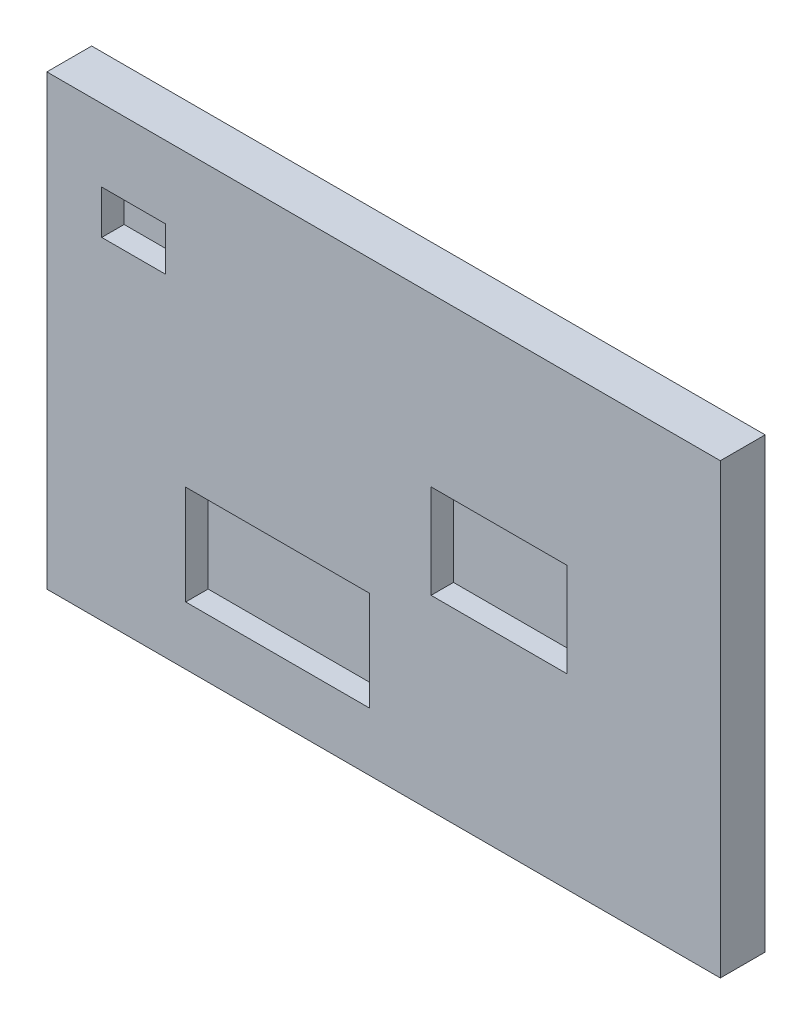
ISO-10303-21;
HEADER;
FILE_DESCRIPTION(('STEP AP214'),'2;1');
FILE_NAME('part.step','',(''),(''),'','','');
FILE_SCHEMA(('AUTOMOTIVE_DESIGN { 1 0 10303 214 1 1 1 1 }'));
ENDSEC;
DATA;
#1=APPLICATION_CONTEXT('core data for automotive mechanical design processes');
#2=APPLICATION_PROTOCOL_DEFINITION('international standard','automotive_design',2000,#1);
#3=PRODUCT_CONTEXT('',#1,'mechanical');
#4=PRODUCT('Part','Part','',(#3));
#5=PRODUCT_RELATED_PRODUCT_CATEGORY('part','',(#4));
#6=PRODUCT_DEFINITION_FORMATION('','',#4);
#7=PRODUCT_DEFINITION_CONTEXT('part definition',#1,'design');
#8=PRODUCT_DEFINITION('design','',#6,#7);
#9=PRODUCT_DEFINITION_SHAPE('','',#8);
#10=(LENGTH_UNIT() NAMED_UNIT(*) SI_UNIT(.MILLI.,.METRE.));
#11=(NAMED_UNIT(*) PLANE_ANGLE_UNIT() SI_UNIT($,.RADIAN.));
#12=(NAMED_UNIT(*) SI_UNIT($,.STERADIAN.) SOLID_ANGLE_UNIT());
#13=UNCERTAINTY_MEASURE_WITH_UNIT(LENGTH_MEASURE(1.E-05),#10,'distance_accuracy_value','');
#14=(GEOMETRIC_REPRESENTATION_CONTEXT(3) GLOBAL_UNCERTAINTY_ASSIGNED_CONTEXT((#13)) GLOBAL_UNIT_ASSIGNED_CONTEXT((#10,
#11,#12)) REPRESENTATION_CONTEXT('',''));
#15=CARTESIAN_POINT('',(0.,0.,0.));
#16=DIRECTION('',(0.,0.,1.));
#17=DIRECTION('',(1.,0.,0.));
#18=AXIS2_PLACEMENT_3D('',#15,#16,#17);
#19=CARTESIAN_POINT('',(-44.7236180904523,25.8793969849246,10.));
#20=DIRECTION('',(1.,0.,0.));
#21=DIRECTION('',(0.,0.,-1.));
#22=AXIS2_PLACEMENT_3D('',#19,#20,#21);
#23=PLANE('',#22);
#24=DIRECTION('',(0.,-1.,0.));
#25=VECTOR('',#24,1.);
#26=CARTESIAN_POINT('',(-44.7236180904523,25.8793969849246,0.));
#27=LINE('',#26,#25);
#28=CARTESIAN_POINT('',(-44.7236180904523,25.8793969849246,0.));
#29=VERTEX_POINT('',#28);
#30=CARTESIAN_POINT('',(-44.7236180904523,-74.1206030150754,0.));
#31=VERTEX_POINT('',#30);
#32=EDGE_CURVE('E198',#29,#31,#27,.T.);
#33=ORIENTED_EDGE('',*,*,#32,.T.);
#34=DIRECTION('',(0.,0.,-1.));
#35=VECTOR('',#34,1.);
#36=CARTESIAN_POINT('',(-44.7236180904523,-74.1206030150754,10.));
#37=LINE('',#36,#35);
#38=CARTESIAN_POINT('',(-44.7236180904523,-74.1206030150754,10.));
#39=VERTEX_POINT('',#38);
#40=EDGE_CURVE('E11',#39,#31,#37,.T.);
#41=ORIENTED_EDGE('',*,*,#40,.F.);
#42=DIRECTION('',(0.,-1.,0.));
#43=VECTOR('',#42,1.);
#44=CARTESIAN_POINT('',(-44.7236180904523,25.8793969849246,10.));
#45=LINE('',#44,#43);
#46=CARTESIAN_POINT('',(-44.7236180904523,25.8793969849246,10.));
#47=VERTEX_POINT('',#46);
#48=EDGE_CURVE('E289',#47,#39,#45,.T.);
#49=ORIENTED_EDGE('',*,*,#48,.F.);
#50=DIRECTION('',(0.,0.,-1.));
#51=VECTOR('',#50,1.);
#52=CARTESIAN_POINT('',(-44.7236180904523,25.8793969849246,10.));
#53=LINE('',#52,#51);
#54=EDGE_CURVE('E303',#47,#29,#53,.T.);
#55=ORIENTED_EDGE('',*,*,#54,.T.);
#56=EDGE_LOOP('',(#33,#41,#49,#55));
#57=FACE_BOUND('',#56,.T.);
#58=ADVANCED_FACE('F39',(#57),#23,.F.);
#59=CARTESIAN_POINT('',(-44.7236180904523,-74.1206030150754,10.));
#60=DIRECTION('',(0.,1.,0.));
#61=DIRECTION('',(0.,0.,1.));
#62=AXIS2_PLACEMENT_3D('',#59,#60,#61);
#63=PLANE('',#62);
#64=DIRECTION('',(1.,0.,0.));
#65=VECTOR('',#64,1.);
#66=CARTESIAN_POINT('',(-44.7236180904523,-74.1206030150754,0.));
#67=LINE('',#66,#65);
#68=CARTESIAN_POINT('',(105.608040199548,-74.1206030150754,0.));
#69=VERTEX_POINT('',#68);
#70=EDGE_CURVE('E307',#31,#69,#67,.T.);
#71=ORIENTED_EDGE('',*,*,#70,.T.);
#72=DIRECTION('',(0.,0.,-1.));
#73=VECTOR('',#72,1.);
#74=CARTESIAN_POINT('',(105.608040199548,-74.1206030150754,10.));
#75=LINE('',#74,#73);
#76=CARTESIAN_POINT('',(105.608040199548,-74.1206030150754,10.));
#77=VERTEX_POINT('',#76);
#78=EDGE_CURVE('E47',#77,#69,#75,.T.);
#79=ORIENTED_EDGE('',*,*,#78,.F.);
#80=DIRECTION('',(1.,0.,0.));
#81=VECTOR('',#80,1.);
#82=CARTESIAN_POINT('',(-44.7236180904523,-74.1206030150754,10.));
#83=LINE('',#82,#81);
#84=EDGE_CURVE('E293',#39,#77,#83,.T.);
#85=ORIENTED_EDGE('',*,*,#84,.F.);
#86=ORIENTED_EDGE('',*,*,#40,.T.);
#87=EDGE_LOOP('',(#71,#79,#85,#86));
#88=FACE_BOUND('',#87,.T.);
#89=ADVANCED_FACE('F343',(#88),#63,.F.);
#90=CARTESIAN_POINT('',(105.608040199548,25.8793969849246,10.));
#91=DIRECTION('',(-1.,0.,0.));
#92=DIRECTION('',(0.,0.,1.));
#93=AXIS2_PLACEMENT_3D('',#90,#91,#92);
#94=PLANE('',#93);
#95=DIRECTION('',(0.,1.,0.));
#96=VECTOR('',#95,1.);
#97=CARTESIAN_POINT('',(105.608040199548,25.8793969849246,0.));
#98=LINE('',#97,#96);
#99=CARTESIAN_POINT('',(105.608040199548,25.8793969849246,0.));
#100=VERTEX_POINT('',#99);
#101=EDGE_CURVE('E310',#69,#100,#98,.T.);
#102=ORIENTED_EDGE('',*,*,#101,.T.);
#103=DIRECTION('',(0.,0.,-1.));
#104=VECTOR('',#103,1.);
#105=CARTESIAN_POINT('',(105.608040199548,25.8793969849246,10.));
#106=LINE('',#105,#104);
#107=CARTESIAN_POINT('',(105.608040199548,25.8793969849246,10.));
#108=VERTEX_POINT('',#107);
#109=EDGE_CURVE('E318',#108,#100,#106,.T.);
#110=ORIENTED_EDGE('',*,*,#109,.F.);
#111=DIRECTION('',(0.,1.,0.));
#112=VECTOR('',#111,1.);
#113=CARTESIAN_POINT('',(105.608040199548,25.8793969849246,10.));
#114=LINE('',#113,#112);
#115=EDGE_CURVE('E297',#77,#108,#114,.T.);
#116=ORIENTED_EDGE('',*,*,#115,.F.);
#117=ORIENTED_EDGE('',*,*,#78,.T.);
#118=EDGE_LOOP('',(#102,#110,#116,#117));
#119=FACE_BOUND('',#118,.T.);
#120=ADVANCED_FACE('F327',(#119),#94,.F.);
#121=CARTESIAN_POINT('',(-44.7236180904523,25.8793969849246,10.));
#122=DIRECTION('',(0.,-1.,0.));
#123=DIRECTION('',(0.,0.,-1.));
#124=AXIS2_PLACEMENT_3D('',#121,#122,#123);
#125=PLANE('',#124);
#126=DIRECTION('',(-1.,0.,0.));
#127=VECTOR('',#126,1.);
#128=CARTESIAN_POINT('',(-44.7236180904523,25.8793969849246,0.));
#129=LINE('',#128,#127);
#130=EDGE_CURVE('E294',#100,#29,#129,.T.);
#131=ORIENTED_EDGE('',*,*,#130,.T.);
#132=ORIENTED_EDGE('',*,*,#54,.F.);
#133=DIRECTION('',(-1.,0.,0.));
#134=VECTOR('',#133,1.);
#135=CARTESIAN_POINT('',(-44.7236180904523,25.8793969849246,10.));
#136=LINE('',#135,#134);
#137=EDGE_CURVE('E300',#108,#47,#136,.T.);
#138=ORIENTED_EDGE('',*,*,#137,.F.);
#139=ORIENTED_EDGE('',*,*,#109,.T.);
#140=EDGE_LOOP('',(#131,#132,#138,#139));
#141=FACE_BOUND('',#140,.T.);
#142=ADVANCED_FACE('F336',(#141),#125,.F.);
#143=CARTESIAN_POINT('',(0.,0.,10.));
#144=DIRECTION('',(0.,0.,1.));
#145=DIRECTION('',(1.,0.,0.));
#146=AXIS2_PLACEMENT_3D('',#143,#144,#145);
#147=PLANE('',#146);
#148=DIRECTION('',(0.,-1.,0.));
#149=VECTOR('',#148,1.);
#150=CARTESIAN_POINT('',(-32.4733505430644,9.73555468860426,10.));
#151=LINE('',#150,#149);
#152=CARTESIAN_POINT('',(-32.4733505430644,9.73555468860426,10.));
#153=VERTEX_POINT('',#152);
#154=CARTESIAN_POINT('',(-32.4733505430644,0.,10.));
#155=VERTEX_POINT('',#154);
#156=EDGE_CURVE('E54',#153,#155,#151,.T.);
#157=ORIENTED_EDGE('',*,*,#156,.F.);
#158=DIRECTION('',(-1.,0.,0.));
#159=VECTOR('',#158,1.);
#160=CARTESIAN_POINT('',(-32.4733505430644,9.73555468860426,10.));
#161=LINE('',#160,#159);
#162=CARTESIAN_POINT('',(-18.1946415280035,9.73555468860426,10.));
#163=VERTEX_POINT('',#162);
#164=EDGE_CURVE('E175',#163,#153,#161,.T.);
#165=ORIENTED_EDGE('',*,*,#164,.F.);
#166=DIRECTION('',(0.,1.,0.));
#167=VECTOR('',#166,1.);
#168=CARTESIAN_POINT('',(-18.1946415280035,9.73555468860426,10.));
#169=LINE('',#168,#167);
#170=CARTESIAN_POINT('',(-18.1946415280035,0.,10.));
#171=VERTEX_POINT('',#170);
#172=EDGE_CURVE('E179',#171,#163,#169,.T.);
#173=ORIENTED_EDGE('',*,*,#172,.F.);
#174=DIRECTION('',(1.,0.,0.));
#175=VECTOR('',#174,1.);
#176=CARTESIAN_POINT('',(-32.4733505430644,0.,10.));
#177=LINE('',#176,#175);
#178=EDGE_CURVE('E188',#155,#171,#177,.T.);
#179=ORIENTED_EDGE('',*,*,#178,.F.);
#180=EDGE_LOOP('',(#157,#165,#173,#179));
#181=FACE_BOUND('',#180,.T.);
#182=DIRECTION('',(0.,-1.,0.));
#183=VECTOR('',#182,1.);
#184=CARTESIAN_POINT('',(41.0396904016633,-11.4594040056268,10.));
#185=LINE('',#184,#183);
#186=CARTESIAN_POINT('',(41.0396904016633,-11.4594040056268,10.));
#187=VERTEX_POINT('',#186);
#188=CARTESIAN_POINT('',(41.0396904016633,-32.4312578714975,10.));
#189=VERTEX_POINT('',#188);
#190=EDGE_CURVE('E62',#187,#189,#185,.T.);
#191=ORIENTED_EDGE('',*,*,#190,.F.);
#192=DIRECTION('',(-1.,0.,0.));
#193=VECTOR('',#192,1.);
#194=CARTESIAN_POINT('',(41.0396904016633,-11.4594040056268,10.));
#195=LINE('',#194,#193);
#196=CARTESIAN_POINT('',(71.3819470586676,-11.4594040056268,10.));
#197=VERTEX_POINT('',#196);
#198=EDGE_CURVE('E209',#197,#187,#195,.T.);
#199=ORIENTED_EDGE('',*,*,#198,.F.);
#200=DIRECTION('',(0.,1.,0.));
#201=VECTOR('',#200,1.);
#202=CARTESIAN_POINT('',(71.3819470586676,-11.4594040056268,10.));
#203=LINE('',#202,#201);
#204=CARTESIAN_POINT('',(71.3819470586676,-32.4312578714975,10.));
#205=VERTEX_POINT('',#204);
#206=EDGE_CURVE('E229',#205,#197,#203,.T.);
#207=ORIENTED_EDGE('',*,*,#206,.F.);
#208=DIRECTION('',(1.,0.,0.));
#209=VECTOR('',#208,1.);
#210=CARTESIAN_POINT('',(41.0396904016633,-32.4312578714975,10.));
#211=LINE('',#210,#209);
#212=EDGE_CURVE('E224',#189,#205,#211,.T.);
#213=ORIENTED_EDGE('',*,*,#212,.F.);
#214=EDGE_LOOP('',(#191,#199,#207,#213));
#215=FACE_BOUND('',#214,.T.);
#216=DIRECTION('',(0.,-1.,0.));
#217=VECTOR('',#216,1.);
#218=CARTESIAN_POINT('',(-13.732544960797,-38.901297893947,10.));
#219=LINE('',#218,#217);
#220=CARTESIAN_POINT('',(-13.732544960797,-38.901297893947,10.));
#221=VERTEX_POINT('',#220);
#222=CARTESIAN_POINT('',(-13.732544960797,-61.1002283157995,10.));
#223=VERTEX_POINT('',#222);
#224=EDGE_CURVE('E264',#221,#223,#219,.T.);
#225=ORIENTED_EDGE('',*,*,#224,.F.);
#226=DIRECTION('',(-1.,0.,0.));
#227=VECTOR('',#226,1.);
#228=CARTESIAN_POINT('',(-13.732544960797,-38.901297893947,10.));
#229=LINE('',#228,#227);
#230=CARTESIAN_POINT('',(27.3187434575032,-38.901297893947,10.));
#231=VERTEX_POINT('',#230);
#232=EDGE_CURVE('E251',#231,#221,#229,.T.);
#233=ORIENTED_EDGE('',*,*,#232,.F.);
#234=DIRECTION('',(0.,1.,0.));
#235=VECTOR('',#234,1.);
#236=CARTESIAN_POINT('',(27.3187434575032,-38.901297893947,10.));
#237=LINE('',#236,#235);
#238=CARTESIAN_POINT('',(27.3187434575032,-61.1002283157995,10.));
#239=VERTEX_POINT('',#238);
#240=EDGE_CURVE('E271',#239,#231,#237,.T.);
#241=ORIENTED_EDGE('',*,*,#240,.F.);
#242=DIRECTION('',(1.,0.,0.));
#243=VECTOR('',#242,1.);
#244=CARTESIAN_POINT('',(-13.732544960797,-61.1002283157995,10.));
#245=LINE('',#244,#243);
#246=EDGE_CURVE('E267',#223,#239,#245,.T.);
#247=ORIENTED_EDGE('',*,*,#246,.F.);
#248=EDGE_LOOP('',(#225,#233,#241,#247));
#249=FACE_BOUND('',#248,.T.);
#250=ORIENTED_EDGE('',*,*,#48,.T.);
#251=ORIENTED_EDGE('',*,*,#84,.T.);
#252=ORIENTED_EDGE('',*,*,#115,.T.);
#253=ORIENTED_EDGE('',*,*,#137,.T.);
#254=EDGE_LOOP('',(#250,#251,#252,#253));
#255=FACE_BOUND('',#254,.T.);
#256=ADVANCED_FACE('F342',(#181,#215,#249,#255),#147,.T.);
#257=CARTESIAN_POINT('',(0.,0.,0.));
#258=DIRECTION('',(0.,0.,1.));
#259=DIRECTION('',(1.,0.,0.));
#260=AXIS2_PLACEMENT_3D('',#257,#258,#259);
#261=PLANE('',#260);
#262=ORIENTED_EDGE('',*,*,#32,.F.);
#263=ORIENTED_EDGE('',*,*,#130,.F.);
#264=ORIENTED_EDGE('',*,*,#101,.F.);
#265=ORIENTED_EDGE('',*,*,#70,.F.);
#266=EDGE_LOOP('',(#262,#263,#264,#265));
#267=FACE_BOUND('',#266,.T.);
#268=ADVANCED_FACE('F333',(#267),#261,.F.);
#269=CARTESIAN_POINT('',(-13.732544960797,-38.901297893947,5.00000000000001));
#270=DIRECTION('',(-1.,0.,0.));
#271=DIRECTION('',(0.,0.,1.));
#272=AXIS2_PLACEMENT_3D('',#269,#270,#271);
#273=PLANE('',#272);
#274=ORIENTED_EDGE('',*,*,#224,.T.);
#275=DIRECTION('',(0.,0.,1.));
#276=VECTOR('',#275,1.);
#277=CARTESIAN_POINT('',(-13.732544960797,-61.1002283157995,5.00000000000001));
#278=LINE('',#277,#276);
#279=CARTESIAN_POINT('',(-13.732544960797,-61.1002283157995,5.00000000000001));
#280=VERTEX_POINT('',#279);
#281=EDGE_CURVE('E263',#280,#223,#278,.T.);
#282=ORIENTED_EDGE('',*,*,#281,.F.);
#283=DIRECTION('',(0.,-1.,0.));
#284=VECTOR('',#283,1.);
#285=CARTESIAN_POINT('',(-13.732544960797,-38.901297893947,5.00000000000001));
#286=LINE('',#285,#284);
#287=CARTESIAN_POINT('',(-13.732544960797,-38.901297893947,5.00000000000001));
#288=VERTEX_POINT('',#287);
#289=EDGE_CURVE('E246',#288,#280,#286,.T.);
#290=ORIENTED_EDGE('',*,*,#289,.F.);
#291=DIRECTION('',(0.,0.,1.));
#292=VECTOR('',#291,1.);
#293=CARTESIAN_POINT('',(-13.732544960797,-38.901297893947,5.00000000000001));
#294=LINE('',#293,#292);
#295=EDGE_CURVE('E225',#288,#221,#294,.T.);
#296=ORIENTED_EDGE('',*,*,#295,.T.);
#297=EDGE_LOOP('',(#274,#282,#290,#296));
#298=FACE_BOUND('',#297,.T.);
#299=ADVANCED_FACE('F355',(#298),#273,.F.);
#300=CARTESIAN_POINT('',(-13.732544960797,-38.901297893947,5.00000000000001));
#301=DIRECTION('',(0.,1.,0.));
#302=DIRECTION('',(0.,0.,1.));
#303=AXIS2_PLACEMENT_3D('',#300,#301,#302);
#304=PLANE('',#303);
#305=ORIENTED_EDGE('',*,*,#232,.T.);
#306=ORIENTED_EDGE('',*,*,#295,.F.);
#307=DIRECTION('',(-1.,0.,0.));
#308=VECTOR('',#307,1.);
#309=CARTESIAN_POINT('',(-13.732544960797,-38.901297893947,5.00000000000001));
#310=LINE('',#309,#308);
#311=CARTESIAN_POINT('',(27.3187434575032,-38.901297893947,5.00000000000001));
#312=VERTEX_POINT('',#311);
#313=EDGE_CURVE('E259',#312,#288,#310,.T.);
#314=ORIENTED_EDGE('',*,*,#313,.F.);
#315=DIRECTION('',(0.,0.,1.));
#316=VECTOR('',#315,1.);
#317=CARTESIAN_POINT('',(27.3187434575032,-38.901297893947,5.00000000000001));
#318=LINE('',#317,#316);
#319=EDGE_CURVE('E280',#312,#231,#318,.T.);
#320=ORIENTED_EDGE('',*,*,#319,.T.);
#321=EDGE_LOOP('',(#305,#306,#314,#320));
#322=FACE_BOUND('',#321,.T.);
#323=ADVANCED_FACE('F361',(#322),#304,.F.);
#324=CARTESIAN_POINT('',(27.3187434575032,-38.901297893947,5.00000000000001));
#325=DIRECTION('',(1.,0.,0.));
#326=DIRECTION('',(0.,0.,-1.));
#327=AXIS2_PLACEMENT_3D('',#324,#325,#326);
#328=PLANE('',#327);
#329=ORIENTED_EDGE('',*,*,#240,.T.);
#330=ORIENTED_EDGE('',*,*,#319,.F.);
#331=DIRECTION('',(0.,1.,0.));
#332=VECTOR('',#331,1.);
#333=CARTESIAN_POINT('',(27.3187434575032,-38.901297893947,5.00000000000001));
#334=LINE('',#333,#332);
#335=CARTESIAN_POINT('',(27.3187434575032,-61.1002283157995,5.00000000000001));
#336=VERTEX_POINT('',#335);
#337=EDGE_CURVE('E255',#336,#312,#334,.T.);
#338=ORIENTED_EDGE('',*,*,#337,.F.);
#339=DIRECTION('',(0.,0.,1.));
#340=VECTOR('',#339,1.);
#341=CARTESIAN_POINT('',(27.3187434575032,-61.1002283157995,5.00000000000001));
#342=LINE('',#341,#340);
#343=EDGE_CURVE('E283',#336,#239,#342,.T.);
#344=ORIENTED_EDGE('',*,*,#343,.T.);
#345=EDGE_LOOP('',(#329,#330,#338,#344));
#346=FACE_BOUND('',#345,.T.);
#347=ADVANCED_FACE('F367',(#346),#328,.F.);
#348=CARTESIAN_POINT('',(-13.732544960797,-61.1002283157995,5.00000000000001));
#349=DIRECTION('',(0.,-1.,0.));
#350=DIRECTION('',(0.,0.,-1.));
#351=AXIS2_PLACEMENT_3D('',#348,#349,#350);
#352=PLANE('',#351);
#353=ORIENTED_EDGE('',*,*,#246,.T.);
#354=ORIENTED_EDGE('',*,*,#343,.F.);
#355=DIRECTION('',(1.,0.,0.));
#356=VECTOR('',#355,1.);
#357=CARTESIAN_POINT('',(-13.732544960797,-61.1002283157995,5.00000000000001));
#358=LINE('',#357,#356);
#359=EDGE_CURVE('E250',#280,#336,#358,.T.);
#360=ORIENTED_EDGE('',*,*,#359,.F.);
#361=ORIENTED_EDGE('',*,*,#281,.T.);
#362=EDGE_LOOP('',(#353,#354,#360,#361));
#363=FACE_BOUND('',#362,.T.);
#364=ADVANCED_FACE('F363',(#363),#352,.F.);
#365=CARTESIAN_POINT('',(0.,0.,5.00000000000001));
#366=DIRECTION('',(0.,0.,1.));
#367=DIRECTION('',(1.,0.,0.));
#368=AXIS2_PLACEMENT_3D('',#365,#366,#367);
#369=PLANE('',#368);
#370=ORIENTED_EDGE('',*,*,#289,.T.);
#371=ORIENTED_EDGE('',*,*,#359,.T.);
#372=ORIENTED_EDGE('',*,*,#337,.T.);
#373=ORIENTED_EDGE('',*,*,#313,.T.);
#374=EDGE_LOOP('',(#370,#371,#372,#373));
#375=FACE_BOUND('',#374,.T.);
#376=ADVANCED_FACE('F366',(#375),#369,.T.);
#377=CARTESIAN_POINT('',(41.0396904016633,-11.4594040056268,5.00000000000001));
#378=DIRECTION('',(-1.,0.,0.));
#379=DIRECTION('',(0.,0.,1.));
#380=AXIS2_PLACEMENT_3D('',#377,#378,#379);
#381=PLANE('',#380);
#382=ORIENTED_EDGE('',*,*,#190,.T.);
#383=DIRECTION('',(0.,0.,1.));
#384=VECTOR('',#383,1.);
#385=CARTESIAN_POINT('',(41.0396904016633,-32.4312578714975,5.00000000000001));
#386=LINE('',#385,#384);
#387=CARTESIAN_POINT('',(41.0396904016633,-32.4312578714975,5.00000000000001));
#388=VERTEX_POINT('',#387);
#389=EDGE_CURVE('E221',#388,#189,#386,.T.);
#390=ORIENTED_EDGE('',*,*,#389,.F.);
#391=DIRECTION('',(0.,-1.,0.));
#392=VECTOR('',#391,1.);
#393=CARTESIAN_POINT('',(41.0396904016633,-11.4594040056268,5.00000000000001));
#394=LINE('',#393,#392);
#395=CARTESIAN_POINT('',(41.0396904016633,-11.4594040056268,5.00000000000001));
#396=VERTEX_POINT('',#395);
#397=EDGE_CURVE('E204',#396,#388,#394,.T.);
#398=ORIENTED_EDGE('',*,*,#397,.F.);
#399=DIRECTION('',(0.,0.,1.));
#400=VECTOR('',#399,1.);
#401=CARTESIAN_POINT('',(41.0396904016633,-11.4594040056268,5.00000000000001));
#402=LINE('',#401,#400);
#403=EDGE_CURVE('E189',#396,#187,#402,.T.);
#404=ORIENTED_EDGE('',*,*,#403,.T.);
#405=EDGE_LOOP('',(#382,#390,#398,#404));
#406=FACE_BOUND('',#405,.T.);
#407=ADVANCED_FACE('F377',(#406),#381,.F.);
#408=CARTESIAN_POINT('',(41.0396904016633,-11.4594040056268,5.00000000000001));
#409=DIRECTION('',(0.,1.,0.));
#410=DIRECTION('',(0.,0.,1.));
#411=AXIS2_PLACEMENT_3D('',#408,#409,#410);
#412=PLANE('',#411);
#413=ORIENTED_EDGE('',*,*,#198,.T.);
#414=ORIENTED_EDGE('',*,*,#403,.F.);
#415=DIRECTION('',(-1.,0.,0.));
#416=VECTOR('',#415,1.);
#417=CARTESIAN_POINT('',(41.0396904016633,-11.4594040056268,5.00000000000001));
#418=LINE('',#417,#416);
#419=CARTESIAN_POINT('',(71.3819470586676,-11.4594040056268,5.00000000000001));
#420=VERTEX_POINT('',#419);
#421=EDGE_CURVE('E217',#420,#396,#418,.T.);
#422=ORIENTED_EDGE('',*,*,#421,.F.);
#423=DIRECTION('',(0.,0.,1.));
#424=VECTOR('',#423,1.);
#425=CARTESIAN_POINT('',(71.3819470586676,-11.4594040056268,5.00000000000001));
#426=LINE('',#425,#424);
#427=EDGE_CURVE('E238',#420,#197,#426,.T.);
#428=ORIENTED_EDGE('',*,*,#427,.T.);
#429=EDGE_LOOP('',(#413,#414,#422,#428));
#430=FACE_BOUND('',#429,.T.);
#431=ADVANCED_FACE('F381',(#430),#412,.F.);
#432=CARTESIAN_POINT('',(71.3819470586676,-11.4594040056268,5.00000000000001));
#433=DIRECTION('',(1.,0.,0.));
#434=DIRECTION('',(0.,0.,-1.));
#435=AXIS2_PLACEMENT_3D('',#432,#433,#434);
#436=PLANE('',#435);
#437=ORIENTED_EDGE('',*,*,#206,.T.);
#438=ORIENTED_EDGE('',*,*,#427,.F.);
#439=DIRECTION('',(0.,1.,0.));
#440=VECTOR('',#439,1.);
#441=CARTESIAN_POINT('',(71.3819470586676,-11.4594040056268,5.00000000000001));
#442=LINE('',#441,#440);
#443=CARTESIAN_POINT('',(71.3819470586676,-32.4312578714975,5.00000000000001));
#444=VERTEX_POINT('',#443);
#445=EDGE_CURVE('E213',#444,#420,#442,.T.);
#446=ORIENTED_EDGE('',*,*,#445,.F.);
#447=DIRECTION('',(0.,0.,1.));
#448=VECTOR('',#447,1.);
#449=CARTESIAN_POINT('',(71.3819470586676,-32.4312578714975,5.00000000000001));
#450=LINE('',#449,#448);
#451=EDGE_CURVE('E241',#444,#205,#450,.T.);
#452=ORIENTED_EDGE('',*,*,#451,.T.);
#453=EDGE_LOOP('',(#437,#438,#446,#452));
#454=FACE_BOUND('',#453,.T.);
#455=ADVANCED_FACE('F386',(#454),#436,.F.);
#456=CARTESIAN_POINT('',(41.0396904016633,-32.4312578714975,5.00000000000001));
#457=DIRECTION('',(0.,-1.,0.));
#458=DIRECTION('',(0.,0.,-1.));
#459=AXIS2_PLACEMENT_3D('',#456,#457,#458);
#460=PLANE('',#459);
#461=ORIENTED_EDGE('',*,*,#212,.T.);
#462=ORIENTED_EDGE('',*,*,#451,.F.);
#463=DIRECTION('',(1.,0.,0.));
#464=VECTOR('',#463,1.);
#465=CARTESIAN_POINT('',(41.0396904016633,-32.4312578714975,5.00000000000001));
#466=LINE('',#465,#464);
#467=EDGE_CURVE('E208',#388,#444,#466,.T.);
#468=ORIENTED_EDGE('',*,*,#467,.F.);
#469=ORIENTED_EDGE('',*,*,#389,.T.);
#470=EDGE_LOOP('',(#461,#462,#468,#469));
#471=FACE_BOUND('',#470,.T.);
#472=ADVANCED_FACE('F382',(#471),#460,.F.);
#473=CARTESIAN_POINT('',(0.,0.,5.00000000000001));
#474=DIRECTION('',(0.,0.,1.));
#475=DIRECTION('',(1.,0.,0.));
#476=AXIS2_PLACEMENT_3D('',#473,#474,#475);
#477=PLANE('',#476);
#478=ORIENTED_EDGE('',*,*,#397,.T.);
#479=ORIENTED_EDGE('',*,*,#467,.T.);
#480=ORIENTED_EDGE('',*,*,#445,.T.);
#481=ORIENTED_EDGE('',*,*,#421,.T.);
#482=EDGE_LOOP('',(#478,#479,#480,#481));
#483=FACE_BOUND('',#482,.T.);
#484=ADVANCED_FACE('F385',(#483),#477,.T.);
#485=CARTESIAN_POINT('',(-32.4733505430644,9.73555468860426,5.00000000000001));
#486=DIRECTION('',(-1.,0.,0.));
#487=DIRECTION('',(0.,0.,1.));
#488=AXIS2_PLACEMENT_3D('',#485,#486,#487);
#489=PLANE('',#488);
#490=ORIENTED_EDGE('',*,*,#156,.T.);
#491=DIRECTION('',(0.,0.,1.));
#492=VECTOR('',#491,1.);
#493=CARTESIAN_POINT('',(-32.4733505430644,0.,5.00000000000001));
#494=LINE('',#493,#492);
#495=CARTESIAN_POINT('',(-32.4733505430644,0.,5.00000000000001));
#496=VERTEX_POINT('',#495);
#497=EDGE_CURVE('E150',#496,#155,#494,.T.);
#498=ORIENTED_EDGE('',*,*,#497,.F.);
#499=DIRECTION('',(0.,-1.,0.));
#500=VECTOR('',#499,1.);
#501=CARTESIAN_POINT('',(-32.4733505430644,9.73555468860426,5.00000000000001));
#502=LINE('',#501,#500);
#503=CARTESIAN_POINT('',(-32.4733505430644,9.73555468860426,5.00000000000001));
#504=VERTEX_POINT('',#503);
#505=EDGE_CURVE('E154',#504,#496,#502,.T.);
#506=ORIENTED_EDGE('',*,*,#505,.F.);
#507=DIRECTION('',(0.,0.,1.));
#508=VECTOR('',#507,1.);
#509=CARTESIAN_POINT('',(-32.4733505430644,9.73555468860426,5.00000000000001));
#510=LINE('',#509,#508);
#511=EDGE_CURVE('E195',#504,#153,#510,.T.);
#512=ORIENTED_EDGE('',*,*,#511,.T.);
#513=EDGE_LOOP('',(#490,#498,#506,#512));
#514=FACE_BOUND('',#513,.T.);
#515=ADVANCED_FACE('F152',(#514),#489,.F.);
#516=CARTESIAN_POINT('',(-32.4733505430644,9.73555468860426,5.00000000000001));
#517=DIRECTION('',(0.,1.,0.));
#518=DIRECTION('',(0.,0.,1.));
#519=AXIS2_PLACEMENT_3D('',#516,#517,#518);
#520=PLANE('',#519);
#521=ORIENTED_EDGE('',*,*,#164,.T.);
#522=ORIENTED_EDGE('',*,*,#511,.F.);
#523=DIRECTION('',(-1.,0.,0.));
#524=VECTOR('',#523,1.);
#525=CARTESIAN_POINT('',(-32.4733505430644,9.73555468860426,5.00000000000001));
#526=LINE('',#525,#524);
#527=CARTESIAN_POINT('',(-18.1946415280035,9.73555468860426,5.00000000000001));
#528=VERTEX_POINT('',#527);
#529=EDGE_CURVE('E161',#528,#504,#526,.T.);
#530=ORIENTED_EDGE('',*,*,#529,.F.);
#531=DIRECTION('',(0.,0.,1.));
#532=VECTOR('',#531,1.);
#533=CARTESIAN_POINT('',(-18.1946415280035,9.73555468860426,5.00000000000001));
#534=LINE('',#533,#532);
#535=EDGE_CURVE('E199',#528,#163,#534,.T.);
#536=ORIENTED_EDGE('',*,*,#535,.T.);
#537=EDGE_LOOP('',(#521,#522,#530,#536));
#538=FACE_BOUND('',#537,.T.);
#539=ADVANCED_FACE('F399',(#538),#520,.F.);
#540=CARTESIAN_POINT('',(-18.1946415280035,9.73555468860426,5.00000000000001));
#541=DIRECTION('',(1.,0.,0.));
#542=DIRECTION('',(0.,0.,-1.));
#543=AXIS2_PLACEMENT_3D('',#540,#541,#542);
#544=PLANE('',#543);
#545=ORIENTED_EDGE('',*,*,#172,.T.);
#546=ORIENTED_EDGE('',*,*,#535,.F.);
#547=DIRECTION('',(0.,1.,0.));
#548=VECTOR('',#547,1.);
#549=CARTESIAN_POINT('',(-18.1946415280035,9.73555468860426,5.00000000000001));
#550=LINE('',#549,#548);
#551=CARTESIAN_POINT('',(-18.1946415280035,0.,5.00000000000001));
#552=VERTEX_POINT('',#551);
#553=EDGE_CURVE('E170',#552,#528,#550,.T.);
#554=ORIENTED_EDGE('',*,*,#553,.F.);
#555=DIRECTION('',(0.,0.,1.));
#556=VECTOR('',#555,1.);
#557=CARTESIAN_POINT('',(-18.1946415280035,0.,5.00000000000001));
#558=LINE('',#557,#556);
#559=EDGE_CURVE('E160',#552,#171,#558,.T.);
#560=ORIENTED_EDGE('',*,*,#559,.T.);
#561=EDGE_LOOP('',(#545,#546,#554,#560));
#562=FACE_BOUND('',#561,.T.);
#563=ADVANCED_FACE('F402',(#562),#544,.F.);
#564=CARTESIAN_POINT('',(-32.4733505430644,0.,5.00000000000001));
#565=DIRECTION('',(0.,-1.,0.));
#566=DIRECTION('',(0.,0.,-1.));
#567=AXIS2_PLACEMENT_3D('',#564,#565,#566);
#568=PLANE('',#567);
#569=ORIENTED_EDGE('',*,*,#178,.T.);
#570=ORIENTED_EDGE('',*,*,#559,.F.);
#571=DIRECTION('',(1.,0.,0.));
#572=VECTOR('',#571,1.);
#573=CARTESIAN_POINT('',(-32.4733505430644,0.,5.00000000000001));
#574=LINE('',#573,#572);
#575=EDGE_CURVE('E164',#496,#552,#574,.T.);
#576=ORIENTED_EDGE('',*,*,#575,.F.);
#577=ORIENTED_EDGE('',*,*,#497,.T.);
#578=EDGE_LOOP('',(#569,#570,#576,#577));
#579=FACE_BOUND('',#578,.T.);
#580=ADVANCED_FACE('F165',(#579),#568,.F.);
#581=CARTESIAN_POINT('',(0.,0.,5.00000000000001));
#582=DIRECTION('',(0.,0.,1.));
#583=DIRECTION('',(1.,0.,0.));
#584=AXIS2_PLACEMENT_3D('',#581,#582,#583);
#585=PLANE('',#584);
#586=ORIENTED_EDGE('',*,*,#505,.T.);
#587=ORIENTED_EDGE('',*,*,#575,.T.);
#588=ORIENTED_EDGE('',*,*,#553,.T.);
#589=ORIENTED_EDGE('',*,*,#529,.T.);
#590=EDGE_LOOP('',(#586,#587,#588,#589));
#591=FACE_BOUND('',#590,.T.);
#592=ADVANCED_FACE('F172',(#591),#585,.T.);
#593=CLOSED_SHELL('',(#58,#89,#120,#142,#256,#268,#299,#323,#347,#364,#376,#407,#431,#455,#472,
#484,#515,#539,#563,#580,#592));
#594=MANIFOLD_SOLID_BREP('B2',#593);
#595=ADVANCED_BREP_SHAPE_REPRESENTATION('',(#18,#594),#14);
#596=SHAPE_DEFINITION_REPRESENTATION(#9,#595);
ENDSEC;
END-ISO-10303-21;
